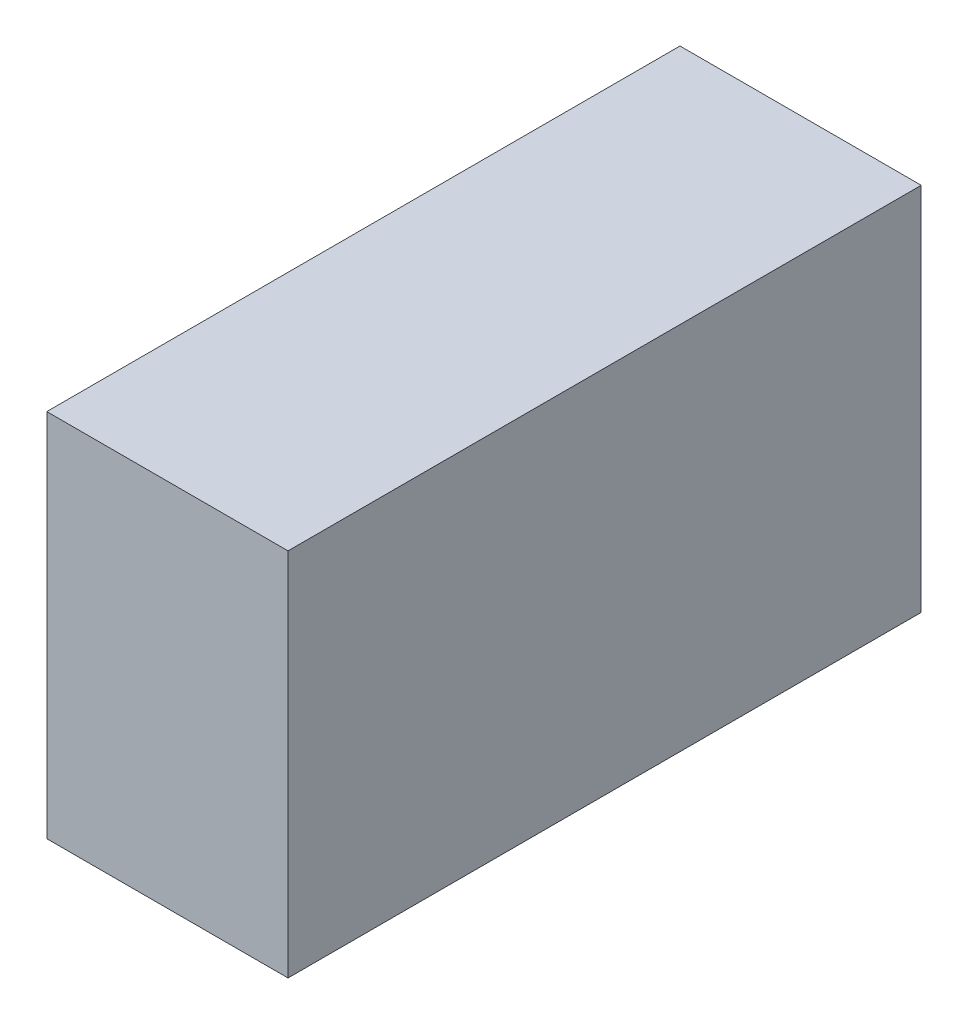
ISO-10303-21;
HEADER;
FILE_DESCRIPTION(('STEP AP214'),'2;1');
FILE_NAME('part.step','',(''),(''),'','','');
FILE_SCHEMA(('AUTOMOTIVE_DESIGN { 1 0 10303 214 1 1 1 1 }'));
ENDSEC;
DATA;
#1=APPLICATION_CONTEXT('core data for automotive mechanical design processes');
#2=APPLICATION_PROTOCOL_DEFINITION('international standard','automotive_design',2000,#1);
#3=PRODUCT_CONTEXT('',#1,'mechanical');
#4=PRODUCT('Part','Part','',(#3));
#5=PRODUCT_RELATED_PRODUCT_CATEGORY('part','',(#4));
#6=PRODUCT_DEFINITION_FORMATION('','',#4);
#7=PRODUCT_DEFINITION_CONTEXT('part definition',#1,'design');
#8=PRODUCT_DEFINITION('design','',#6,#7);
#9=PRODUCT_DEFINITION_SHAPE('','',#8);
#10=(LENGTH_UNIT() NAMED_UNIT(*) SI_UNIT(.MILLI.,.METRE.));
#11=(NAMED_UNIT(*) PLANE_ANGLE_UNIT() SI_UNIT($,.RADIAN.));
#12=(NAMED_UNIT(*) SI_UNIT($,.STERADIAN.) SOLID_ANGLE_UNIT());
#13=UNCERTAINTY_MEASURE_WITH_UNIT(LENGTH_MEASURE(1.E-05),#10,'distance_accuracy_value','');
#14=(GEOMETRIC_REPRESENTATION_CONTEXT(3) GLOBAL_UNCERTAINTY_ASSIGNED_CONTEXT((#13)) GLOBAL_UNIT_ASSIGNED_CONTEXT((#10,
#11,#12)) REPRESENTATION_CONTEXT('',''));
#15=CARTESIAN_POINT('',(0.,0.,0.));
#16=DIRECTION('',(0.,0.,1.));
#17=DIRECTION('',(1.,0.,0.));
#18=AXIS2_PLACEMENT_3D('',#15,#16,#17);
#19=CARTESIAN_POINT('',(0.9525,-1.4605,0.));
#20=DIRECTION('',(-1.,0.,0.));
#21=DIRECTION('',(0.,0.,1.));
#22=AXIS2_PLACEMENT_3D('',#19,#20,#21);
#23=PLANE('',#22);
#24=DIRECTION('',(0.,0.,-1.));
#25=VECTOR('',#24,1.);
#26=CARTESIAN_POINT('',(0.9525,1.4605,0.));
#27=LINE('',#26,#25);
#28=CARTESIAN_POINT('',(0.9525,1.4605,0.));
#29=VERTEX_POINT('',#28);
#30=CARTESIAN_POINT('',(0.9525,1.4605,5.));
#31=VERTEX_POINT('',#30);
#32=EDGE_CURVE('E20',#29,#31,#27,.F.);
#33=ORIENTED_EDGE('',*,*,#32,.T.);
#34=DIRECTION('',(0.,1.,0.));
#35=VECTOR('',#34,1.);
#36=CARTESIAN_POINT('',(0.9525,1.4605,5.));
#37=LINE('',#36,#35);
#38=CARTESIAN_POINT('',(0.9525,-1.4605,5.));
#39=VERTEX_POINT('',#38);
#40=EDGE_CURVE('E55',#31,#39,#37,.F.);
#41=ORIENTED_EDGE('',*,*,#40,.T.);
#42=DIRECTION('',(0.,0.,1.));
#43=VECTOR('',#42,1.);
#44=CARTESIAN_POINT('',(0.9525,-1.4605,0.));
#45=LINE('',#44,#43);
#46=CARTESIAN_POINT('',(0.9525,-1.4605,0.));
#47=VERTEX_POINT('',#46);
#48=EDGE_CURVE('E74',#39,#47,#45,.F.);
#49=ORIENTED_EDGE('',*,*,#48,.T.);
#50=DIRECTION('',(0.,1.,0.));
#51=VECTOR('',#50,1.);
#52=CARTESIAN_POINT('',(0.9525,1.4605,0.));
#53=LINE('',#52,#51);
#54=EDGE_CURVE('E66',#29,#47,#53,.F.);
#55=ORIENTED_EDGE('',*,*,#54,.F.);
#56=EDGE_LOOP('',(#33,#41,#49,#55));
#57=FACE_BOUND('',#56,.T.);
#58=ADVANCED_FACE('F17',(#57),#23,.F.);
#59=CARTESIAN_POINT('',(0.9525,1.4605,0.));
#60=DIRECTION('',(0.,-1.,0.));
#61=DIRECTION('',(0.,0.,-1.));
#62=AXIS2_PLACEMENT_3D('',#59,#60,#61);
#63=PLANE('',#62);
#64=DIRECTION('',(0.,0.,-1.));
#65=VECTOR('',#64,1.);
#66=CARTESIAN_POINT('',(-0.9525,1.4605,0.));
#67=LINE('',#66,#65);
#68=CARTESIAN_POINT('',(-0.9525,1.4605,0.));
#69=VERTEX_POINT('',#68);
#70=CARTESIAN_POINT('',(-0.9525,1.4605,5.));
#71=VERTEX_POINT('',#70);
#72=EDGE_CURVE('E72',#69,#71,#67,.F.);
#73=ORIENTED_EDGE('',*,*,#72,.T.);
#74=DIRECTION('',(-1.,0.,0.));
#75=VECTOR('',#74,1.);
#76=CARTESIAN_POINT('',(0.9525,1.4605,5.));
#77=LINE('',#76,#75);
#78=EDGE_CURVE('E62',#71,#31,#77,.F.);
#79=ORIENTED_EDGE('',*,*,#78,.T.);
#80=ORIENTED_EDGE('',*,*,#32,.F.);
#81=DIRECTION('',(-1.,0.,0.));
#82=VECTOR('',#81,1.);
#83=CARTESIAN_POINT('',(0.9525,1.4605,0.));
#84=LINE('',#83,#82);
#85=EDGE_CURVE('E80',#69,#29,#84,.F.);
#86=ORIENTED_EDGE('',*,*,#85,.F.);
#87=EDGE_LOOP('',(#73,#79,#80,#86));
#88=FACE_BOUND('',#87,.T.);
#89=ADVANCED_FACE('F71',(#88),#63,.F.);
#90=CARTESIAN_POINT('',(0.9525,1.4605,5.));
#91=DIRECTION('',(0.,0.,-1.));
#92=DIRECTION('',(-1.,0.,0.));
#93=AXIS2_PLACEMENT_3D('',#90,#91,#92);
#94=PLANE('',#93);
#95=DIRECTION('',(0.,1.,0.));
#96=VECTOR('',#95,1.);
#97=CARTESIAN_POINT('',(-0.9525,1.4605,5.));
#98=LINE('',#97,#96);
#99=CARTESIAN_POINT('',(-0.9525,-1.4605,5.));
#100=VERTEX_POINT('',#99);
#101=EDGE_CURVE('E83',#71,#100,#98,.F.);
#102=ORIENTED_EDGE('',*,*,#101,.T.);
#103=DIRECTION('',(1.,0.,0.));
#104=VECTOR('',#103,1.);
#105=CARTESIAN_POINT('',(-0.9525,-1.4605,5.));
#106=LINE('',#105,#104);
#107=EDGE_CURVE('E64',#100,#39,#106,.T.);
#108=ORIENTED_EDGE('',*,*,#107,.T.);
#109=ORIENTED_EDGE('',*,*,#40,.F.);
#110=ORIENTED_EDGE('',*,*,#78,.F.);
#111=EDGE_LOOP('',(#102,#108,#109,#110));
#112=FACE_BOUND('',#111,.T.);
#113=ADVANCED_FACE('F60',(#112),#94,.F.);
#114=CARTESIAN_POINT('',(-0.9525,-1.4605,0.));
#115=DIRECTION('',(0.,1.,0.));
#116=DIRECTION('',(0.,0.,1.));
#117=AXIS2_PLACEMENT_3D('',#114,#115,#116);
#118=PLANE('',#117);
#119=ORIENTED_EDGE('',*,*,#48,.F.);
#120=ORIENTED_EDGE('',*,*,#107,.F.);
#121=DIRECTION('',(0.,0.,-1.));
#122=VECTOR('',#121,1.);
#123=CARTESIAN_POINT('',(-0.9525,-1.4605,0.));
#124=LINE('',#123,#122);
#125=CARTESIAN_POINT('',(-0.9525,-1.4605,0.));
#126=VERTEX_POINT('',#125);
#127=EDGE_CURVE('E26',#100,#126,#124,.T.);
#128=ORIENTED_EDGE('',*,*,#127,.T.);
#129=DIRECTION('',(-1.,0.,0.));
#130=VECTOR('',#129,1.);
#131=CARTESIAN_POINT('',(0.9525,-1.4605,0.));
#132=LINE('',#131,#130);
#133=EDGE_CURVE('E34',#47,#126,#132,.T.);
#134=ORIENTED_EDGE('',*,*,#133,.F.);
#135=EDGE_LOOP('',(#119,#120,#128,#134));
#136=FACE_BOUND('',#135,.T.);
#137=ADVANCED_FACE('F88',(#136),#118,.F.);
#138=CARTESIAN_POINT('',(0.9525,1.4605,0.));
#139=DIRECTION('',(0.,0.,-1.));
#140=DIRECTION('',(-1.,0.,0.));
#141=AXIS2_PLACEMENT_3D('',#138,#139,#140);
#142=PLANE('',#141);
#143=DIRECTION('',(0.,1.,0.));
#144=VECTOR('',#143,1.);
#145=CARTESIAN_POINT('',(-0.9525,1.4605,0.));
#146=LINE('',#145,#144);
#147=EDGE_CURVE('E11',#126,#69,#146,.T.);
#148=ORIENTED_EDGE('',*,*,#147,.T.);
#149=ORIENTED_EDGE('',*,*,#85,.T.);
#150=ORIENTED_EDGE('',*,*,#54,.T.);
#151=ORIENTED_EDGE('',*,*,#133,.T.);
#152=EDGE_LOOP('',(#148,#149,#150,#151));
#153=FACE_BOUND('',#152,.T.);
#154=ADVANCED_FACE('F91',(#153),#142,.T.);
#155=CARTESIAN_POINT('',(-0.9525,1.4605,0.));
#156=DIRECTION('',(1.,0.,0.));
#157=DIRECTION('',(0.,0.,-1.));
#158=AXIS2_PLACEMENT_3D('',#155,#156,#157);
#159=PLANE('',#158);
#160=ORIENTED_EDGE('',*,*,#127,.F.);
#161=ORIENTED_EDGE('',*,*,#101,.F.);
#162=ORIENTED_EDGE('',*,*,#72,.F.);
#163=ORIENTED_EDGE('',*,*,#147,.F.);
#164=EDGE_LOOP('',(#160,#161,#162,#163));
#165=FACE_BOUND('',#164,.T.);
#166=ADVANCED_FACE('F90',(#165),#159,.F.);
#167=CLOSED_SHELL('',(#58,#89,#113,#137,#154,#166));
#168=MANIFOLD_SOLID_BREP('B1',#167);
#169=ADVANCED_BREP_SHAPE_REPRESENTATION('',(#18,#168),#14);
#170=SHAPE_DEFINITION_REPRESENTATION(#9,#169);
ENDSEC;
END-ISO-10303-21;
